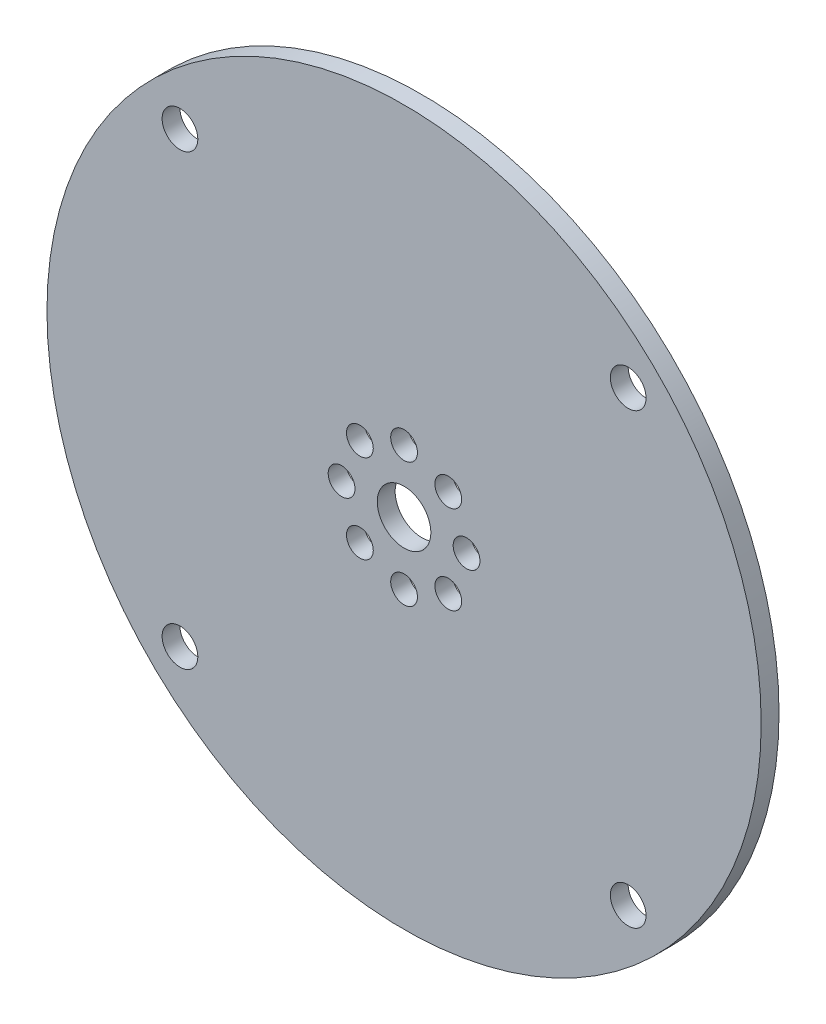
ISO-10303-21;
HEADER;
FILE_DESCRIPTION(('STEP AP214'),'2;1');
FILE_NAME('part.step','',(''),(''),'','','');
FILE_SCHEMA(('AUTOMOTIVE_DESIGN { 1 0 10303 214 1 1 1 1 }'));
ENDSEC;
DATA;
#1=APPLICATION_CONTEXT('core data for automotive mechanical design processes');
#2=APPLICATION_PROTOCOL_DEFINITION('international standard','automotive_design',2000,#1);
#3=PRODUCT_CONTEXT('',#1,'mechanical');
#4=PRODUCT('Part','Part','',(#3));
#5=PRODUCT_RELATED_PRODUCT_CATEGORY('part','',(#4));
#6=PRODUCT_DEFINITION_FORMATION('','',#4);
#7=PRODUCT_DEFINITION_CONTEXT('part definition',#1,'design');
#8=PRODUCT_DEFINITION('design','',#6,#7);
#9=PRODUCT_DEFINITION_SHAPE('','',#8);
#10=(LENGTH_UNIT() NAMED_UNIT(*) SI_UNIT(.MILLI.,.METRE.));
#11=(NAMED_UNIT(*) PLANE_ANGLE_UNIT() SI_UNIT($,.RADIAN.));
#12=(NAMED_UNIT(*) SI_UNIT($,.STERADIAN.) SOLID_ANGLE_UNIT());
#13=UNCERTAINTY_MEASURE_WITH_UNIT(LENGTH_MEASURE(1.E-05),#10,'distance_accuracy_value','');
#14=(GEOMETRIC_REPRESENTATION_CONTEXT(3) GLOBAL_UNCERTAINTY_ASSIGNED_CONTEXT((#13)) GLOBAL_UNIT_ASSIGNED_CONTEXT((#10,
#11,#12)) REPRESENTATION_CONTEXT('',''));
#15=CARTESIAN_POINT('',(0.,0.,0.));
#16=DIRECTION('',(0.,0.,1.));
#17=DIRECTION('',(1.,0.,0.));
#18=AXIS2_PLACEMENT_3D('',#15,#16,#17);
#19=CARTESIAN_POINT('',(2678.75201701699,1971.59180475259,2.));
#20=DIRECTION('',(0.,0.,-1.));
#21=DIRECTION('',(-1.,0.,0.));
#22=AXIS2_PLACEMENT_3D('',#19,#20,#21);
#23=CYLINDRICAL_SURFACE('',#22,2.00000000000022);
#24=CARTESIAN_POINT('',(2678.75201701699,1971.59180475259,2.));
#25=DIRECTION('',(0.,0.,1.));
#26=DIRECTION('',(1.,0.,0.));
#27=AXIS2_PLACEMENT_3D('',#24,#25,#26);
#28=CIRCLE('',#27,2.00000000000022);
#29=CARTESIAN_POINT('',(2680.75201701699,1971.59180475259,2.));
#30=VERTEX_POINT('',#29);
#31=EDGE_CURVE('E51',#30,#30,#28,.T.);
#32=ORIENTED_EDGE('',*,*,#31,.T.);
#33=EDGE_LOOP('',(#32));
#34=FACE_BOUND('',#33,.T.);
#35=CARTESIAN_POINT('',(2678.75201701699,1971.59180475259,0.));
#36=DIRECTION('',(0.,0.,1.));
#37=DIRECTION('',(1.,0.,0.));
#38=AXIS2_PLACEMENT_3D('',#35,#36,#37);
#39=CIRCLE('',#38,2.00000000000022);
#40=CARTESIAN_POINT('',(2680.75201701699,1971.59180475259,0.));
#41=VERTEX_POINT('',#40);
#42=EDGE_CURVE('E95',#41,#41,#39,.T.);
#43=ORIENTED_EDGE('',*,*,#42,.F.);
#44=EDGE_LOOP('',(#43));
#45=FACE_BOUND('',#44,.T.);
#46=ADVANCED_FACE('F43',(#34,#45),#23,.F.);
#47=CARTESIAN_POINT('',(2628.54743555275,1971.59180475259,2.));
#48=DIRECTION('',(0.,0.,-1.));
#49=DIRECTION('',(-1.,0.,0.));
#50=AXIS2_PLACEMENT_3D('',#47,#48,#49);
#51=CYLINDRICAL_SURFACE('',#50,1.99999999999978);
#52=CARTESIAN_POINT('',(2628.54743555275,1971.59180475259,2.));
#53=DIRECTION('',(0.,0.,1.));
#54=DIRECTION('',(1.,0.,0.));
#55=AXIS2_PLACEMENT_3D('',#52,#53,#54);
#56=CIRCLE('',#55,1.99999999999978);
#57=CARTESIAN_POINT('',(2630.54743555275,1971.59180475259,2.));
#58=VERTEX_POINT('',#57);
#59=EDGE_CURVE('E56',#58,#58,#56,.T.);
#60=ORIENTED_EDGE('',*,*,#59,.T.);
#61=EDGE_LOOP('',(#60));
#62=FACE_BOUND('',#61,.T.);
#63=CARTESIAN_POINT('',(2628.54743555275,1971.59180475259,0.));
#64=DIRECTION('',(0.,0.,1.));
#65=DIRECTION('',(1.,0.,0.));
#66=AXIS2_PLACEMENT_3D('',#63,#64,#65);
#67=CIRCLE('',#66,1.99999999999978);
#68=CARTESIAN_POINT('',(2630.54743555275,1971.59180475259,0.));
#69=VERTEX_POINT('',#68);
#70=EDGE_CURVE('E93',#69,#69,#67,.T.);
#71=ORIENTED_EDGE('',*,*,#70,.F.);
#72=EDGE_LOOP('',(#71));
#73=FACE_BOUND('',#72,.T.);
#74=ADVANCED_FACE('F140',(#62,#73),#51,.F.);
#75=CARTESIAN_POINT('',(2653.64972628487,1939.48951402047,2.));
#76=DIRECTION('',(0.,0.,-1.));
#77=DIRECTION('',(-1.,0.,0.));
#78=AXIS2_PLACEMENT_3D('',#75,#76,#77);
#79=CYLINDRICAL_SURFACE('',#78,1.50000000000006);
#80=CARTESIAN_POINT('',(2653.64972628487,1939.48951402047,2.));
#81=DIRECTION('',(0.,0.,1.));
#82=DIRECTION('',(1.,0.,0.));
#83=AXIS2_PLACEMENT_3D('',#80,#81,#82);
#84=CIRCLE('',#83,1.50000000000006);
#85=CARTESIAN_POINT('',(2655.14972628487,1939.48951402047,2.));
#86=VERTEX_POINT('',#85);
#87=EDGE_CURVE('E135',#86,#86,#84,.T.);
#88=ORIENTED_EDGE('',*,*,#87,.T.);
#89=EDGE_LOOP('',(#88));
#90=FACE_BOUND('',#89,.T.);
#91=CARTESIAN_POINT('',(2653.64972628487,1939.48951402047,0.));
#92=DIRECTION('',(0.,0.,1.));
#93=DIRECTION('',(1.,0.,0.));
#94=AXIS2_PLACEMENT_3D('',#91,#92,#93);
#95=CIRCLE('',#94,1.50000000000006);
#96=CARTESIAN_POINT('',(2655.14972628487,1939.48951402047,0.));
#97=VERTEX_POINT('',#96);
#98=EDGE_CURVE('E90',#97,#97,#95,.T.);
#99=ORIENTED_EDGE('',*,*,#98,.F.);
#100=EDGE_LOOP('',(#99));
#101=FACE_BOUND('',#100,.T.);
#102=ADVANCED_FACE('F158',(#90,#101),#79,.F.);
#103=CARTESIAN_POINT('',(2653.64972628487,1953.48951402047,2.));
#104=DIRECTION('',(0.,0.,-1.));
#105=DIRECTION('',(-1.,0.,0.));
#106=AXIS2_PLACEMENT_3D('',#103,#104,#105);
#107=CYLINDRICAL_SURFACE('',#106,1.50000000000006);
#108=CARTESIAN_POINT('',(2653.64972628487,1953.48951402047,2.));
#109=DIRECTION('',(0.,0.,1.));
#110=DIRECTION('',(1.,0.,0.));
#111=AXIS2_PLACEMENT_3D('',#108,#109,#110);
#112=CIRCLE('',#111,1.50000000000006);
#113=CARTESIAN_POINT('',(2655.14972628487,1953.48951402047,2.));
#114=VERTEX_POINT('',#113);
#115=EDGE_CURVE('E132',#114,#114,#112,.T.);
#116=ORIENTED_EDGE('',*,*,#115,.T.);
#117=EDGE_LOOP('',(#116));
#118=FACE_BOUND('',#117,.T.);
#119=CARTESIAN_POINT('',(2653.64972628487,1953.48951402047,0.));
#120=DIRECTION('',(0.,0.,1.));
#121=DIRECTION('',(1.,0.,0.));
#122=AXIS2_PLACEMENT_3D('',#119,#120,#121);
#123=CIRCLE('',#122,1.50000000000006);
#124=CARTESIAN_POINT('',(2655.14972628487,1953.48951402047,0.));
#125=VERTEX_POINT('',#124);
#126=EDGE_CURVE('E87',#125,#125,#123,.T.);
#127=ORIENTED_EDGE('',*,*,#126,.F.);
#128=EDGE_LOOP('',(#127));
#129=FACE_BOUND('',#128,.T.);
#130=ADVANCED_FACE('F165',(#118,#129),#107,.F.);
#131=CARTESIAN_POINT('',(2628.54743555275,1921.38722328835,2.));
#132=DIRECTION('',(0.,0.,-1.));
#133=DIRECTION('',(-1.,0.,0.));
#134=AXIS2_PLACEMENT_3D('',#131,#132,#133);
#135=CYLINDRICAL_SURFACE('',#134,1.99999999999978);
#136=CARTESIAN_POINT('',(2628.54743555275,1921.38722328835,2.));
#137=DIRECTION('',(0.,0.,1.));
#138=DIRECTION('',(1.,0.,0.));
#139=AXIS2_PLACEMENT_3D('',#136,#137,#138);
#140=CIRCLE('',#139,1.99999999999978);
#141=CARTESIAN_POINT('',(2630.54743555275,1921.38722328835,2.));
#142=VERTEX_POINT('',#141);
#143=EDGE_CURVE('E129',#142,#142,#140,.T.);
#144=ORIENTED_EDGE('',*,*,#143,.T.);
#145=EDGE_LOOP('',(#144));
#146=FACE_BOUND('',#145,.T.);
#147=CARTESIAN_POINT('',(2628.54743555275,1921.38722328835,0.));
#148=DIRECTION('',(0.,0.,1.));
#149=DIRECTION('',(1.,0.,0.));
#150=AXIS2_PLACEMENT_3D('',#147,#148,#149);
#151=CIRCLE('',#150,1.99999999999978);
#152=CARTESIAN_POINT('',(2630.54743555275,1921.38722328835,0.));
#153=VERTEX_POINT('',#152);
#154=EDGE_CURVE('E84',#153,#153,#151,.T.);
#155=ORIENTED_EDGE('',*,*,#154,.F.);
#156=EDGE_LOOP('',(#155));
#157=FACE_BOUND('',#156,.T.);
#158=ADVANCED_FACE('F169',(#146,#157),#135,.F.);
#159=CARTESIAN_POINT('',(2678.75201701699,1921.38722328835,2.));
#160=DIRECTION('',(0.,0.,-1.));
#161=DIRECTION('',(-1.,0.,0.));
#162=AXIS2_PLACEMENT_3D('',#159,#160,#161);
#163=CYLINDRICAL_SURFACE('',#162,2.00000000000022);
#164=CARTESIAN_POINT('',(2678.75201701699,1921.38722328835,2.));
#165=DIRECTION('',(0.,0.,1.));
#166=DIRECTION('',(1.,0.,0.));
#167=AXIS2_PLACEMENT_3D('',#164,#165,#166);
#168=CIRCLE('',#167,2.00000000000022);
#169=CARTESIAN_POINT('',(2680.75201701699,1921.38722328835,2.));
#170=VERTEX_POINT('',#169);
#171=EDGE_CURVE('E126',#170,#170,#168,.T.);
#172=ORIENTED_EDGE('',*,*,#171,.T.);
#173=EDGE_LOOP('',(#172));
#174=FACE_BOUND('',#173,.T.);
#175=CARTESIAN_POINT('',(2678.75201701699,1921.38722328835,0.));
#176=DIRECTION('',(0.,0.,1.));
#177=DIRECTION('',(1.,0.,0.));
#178=AXIS2_PLACEMENT_3D('',#175,#176,#177);
#179=CIRCLE('',#178,2.00000000000022);
#180=CARTESIAN_POINT('',(2680.75201701699,1921.38722328835,0.));
#181=VERTEX_POINT('',#180);
#182=EDGE_CURVE('E81',#181,#181,#179,.T.);
#183=ORIENTED_EDGE('',*,*,#182,.F.);
#184=EDGE_LOOP('',(#183));
#185=FACE_BOUND('',#184,.T.);
#186=ADVANCED_FACE('F173',(#174,#185),#163,.F.);
#187=CARTESIAN_POINT('',(2646.64972628487,1946.48951402047,2.));
#188=DIRECTION('',(0.,0.,-1.));
#189=DIRECTION('',(-1.,0.,0.));
#190=AXIS2_PLACEMENT_3D('',#187,#188,#189);
#191=CYLINDRICAL_SURFACE('',#190,1.50000000000006);
#192=CARTESIAN_POINT('',(2646.64972628487,1946.48951402047,2.));
#193=DIRECTION('',(0.,0.,1.));
#194=DIRECTION('',(1.,0.,0.));
#195=AXIS2_PLACEMENT_3D('',#192,#193,#194);
#196=CIRCLE('',#195,1.50000000000006);
#197=CARTESIAN_POINT('',(2648.14972628487,1946.48951402047,2.));
#198=VERTEX_POINT('',#197);
#199=EDGE_CURVE('E123',#198,#198,#196,.T.);
#200=ORIENTED_EDGE('',*,*,#199,.T.);
#201=EDGE_LOOP('',(#200));
#202=FACE_BOUND('',#201,.T.);
#203=CARTESIAN_POINT('',(2646.64972628487,1946.48951402047,0.));
#204=DIRECTION('',(0.,0.,1.));
#205=DIRECTION('',(1.,0.,0.));
#206=AXIS2_PLACEMENT_3D('',#203,#204,#205);
#207=CIRCLE('',#206,1.50000000000006);
#208=CARTESIAN_POINT('',(2648.14972628487,1946.48951402047,0.));
#209=VERTEX_POINT('',#208);
#210=EDGE_CURVE('E78',#209,#209,#207,.T.);
#211=ORIENTED_EDGE('',*,*,#210,.F.);
#212=EDGE_LOOP('',(#211));
#213=FACE_BOUND('',#212,.T.);
#214=ADVANCED_FACE('F177',(#202,#213),#191,.F.);
#215=CARTESIAN_POINT('',(2660.64972628487,1946.48951402047,2.));
#216=DIRECTION('',(0.,0.,-1.));
#217=DIRECTION('',(-1.,0.,0.));
#218=AXIS2_PLACEMENT_3D('',#215,#216,#217);
#219=CYLINDRICAL_SURFACE('',#218,1.50000000000006);
#220=CARTESIAN_POINT('',(2660.64972628487,1946.48951402047,2.));
#221=DIRECTION('',(0.,0.,1.));
#222=DIRECTION('',(1.,0.,0.));
#223=AXIS2_PLACEMENT_3D('',#220,#221,#222);
#224=CIRCLE('',#223,1.50000000000006);
#225=CARTESIAN_POINT('',(2662.14972628487,1946.48951402047,2.));
#226=VERTEX_POINT('',#225);
#227=EDGE_CURVE('E120',#226,#226,#224,.T.);
#228=ORIENTED_EDGE('',*,*,#227,.T.);
#229=EDGE_LOOP('',(#228));
#230=FACE_BOUND('',#229,.T.);
#231=CARTESIAN_POINT('',(2660.64972628487,1946.48951402047,0.));
#232=DIRECTION('',(0.,0.,1.));
#233=DIRECTION('',(1.,0.,0.));
#234=AXIS2_PLACEMENT_3D('',#231,#232,#233);
#235=CIRCLE('',#234,1.50000000000006);
#236=CARTESIAN_POINT('',(2662.14972628487,1946.48951402047,0.));
#237=VERTEX_POINT('',#236);
#238=EDGE_CURVE('E75',#237,#237,#235,.T.);
#239=ORIENTED_EDGE('',*,*,#238,.F.);
#240=EDGE_LOOP('',(#239));
#241=FACE_BOUND('',#240,.T.);
#242=ADVANCED_FACE('F181',(#230,#241),#219,.F.);
#243=CARTESIAN_POINT('',(2653.64972628487,1946.48951402047,2.));
#244=DIRECTION('',(0.,0.,-1.));
#245=DIRECTION('',(-1.,0.,0.));
#246=AXIS2_PLACEMENT_3D('',#243,#244,#245);
#247=CYLINDRICAL_SURFACE('',#246,3.00000000000011);
#248=CARTESIAN_POINT('',(2653.64972628487,1946.48951402047,2.));
#249=DIRECTION('',(0.,0.,1.));
#250=DIRECTION('',(1.,0.,0.));
#251=AXIS2_PLACEMENT_3D('',#248,#249,#250);
#252=CIRCLE('',#251,3.00000000000011);
#253=CARTESIAN_POINT('',(2656.64972628487,1946.48951402047,2.));
#254=VERTEX_POINT('',#253);
#255=EDGE_CURVE('E117',#254,#254,#252,.T.);
#256=ORIENTED_EDGE('',*,*,#255,.T.);
#257=EDGE_LOOP('',(#256));
#258=FACE_BOUND('',#257,.T.);
#259=CARTESIAN_POINT('',(2653.64972628487,1946.48951402047,0.));
#260=DIRECTION('',(0.,0.,1.));
#261=DIRECTION('',(1.,0.,0.));
#262=AXIS2_PLACEMENT_3D('',#259,#260,#261);
#263=CIRCLE('',#262,3.00000000000011);
#264=CARTESIAN_POINT('',(2656.64972628487,1946.48951402047,0.));
#265=VERTEX_POINT('',#264);
#266=EDGE_CURVE('E72',#265,#265,#263,.T.);
#267=ORIENTED_EDGE('',*,*,#266,.F.);
#268=EDGE_LOOP('',(#267));
#269=FACE_BOUND('',#268,.T.);
#270=ADVANCED_FACE('F185',(#258,#269),#247,.F.);
#271=CARTESIAN_POINT('',(2648.69997881656,1941.53976655217,2.));
#272=DIRECTION('',(0.,0.,-1.));
#273=DIRECTION('',(-1.,0.,0.));
#274=AXIS2_PLACEMENT_3D('',#271,#272,#273);
#275=CYLINDRICAL_SURFACE('',#274,1.50000000000006);
#276=CARTESIAN_POINT('',(2648.69997881656,1941.53976655217,2.));
#277=DIRECTION('',(0.,0.,1.));
#278=DIRECTION('',(1.,0.,0.));
#279=AXIS2_PLACEMENT_3D('',#276,#277,#278);
#280=CIRCLE('',#279,1.50000000000006);
#281=CARTESIAN_POINT('',(2650.19997881656,1941.53976655217,2.));
#282=VERTEX_POINT('',#281);
#283=EDGE_CURVE('E114',#282,#282,#280,.T.);
#284=ORIENTED_EDGE('',*,*,#283,.T.);
#285=EDGE_LOOP('',(#284));
#286=FACE_BOUND('',#285,.T.);
#287=CARTESIAN_POINT('',(2648.69997881656,1941.53976655217,0.));
#288=DIRECTION('',(0.,0.,1.));
#289=DIRECTION('',(1.,0.,0.));
#290=AXIS2_PLACEMENT_3D('',#287,#288,#289);
#291=CIRCLE('',#290,1.50000000000006);
#292=CARTESIAN_POINT('',(2650.19997881656,1941.53976655217,0.));
#293=VERTEX_POINT('',#292);
#294=EDGE_CURVE('E69',#293,#293,#291,.T.);
#295=ORIENTED_EDGE('',*,*,#294,.F.);
#296=EDGE_LOOP('',(#295));
#297=FACE_BOUND('',#296,.T.);
#298=ADVANCED_FACE('F189',(#286,#297),#275,.F.);
#299=CARTESIAN_POINT('',(2658.59947375317,1941.53976655217,2.));
#300=DIRECTION('',(0.,0.,-1.));
#301=DIRECTION('',(-1.,0.,0.));
#302=AXIS2_PLACEMENT_3D('',#299,#300,#301);
#303=CYLINDRICAL_SURFACE('',#302,1.50000000000006);
#304=CARTESIAN_POINT('',(2658.59947375317,1941.53976655217,2.));
#305=DIRECTION('',(0.,0.,1.));
#306=DIRECTION('',(1.,0.,0.));
#307=AXIS2_PLACEMENT_3D('',#304,#305,#306);
#308=CIRCLE('',#307,1.50000000000006);
#309=CARTESIAN_POINT('',(2660.09947375317,1941.53976655217,2.));
#310=VERTEX_POINT('',#309);
#311=EDGE_CURVE('E109',#310,#310,#308,.T.);
#312=ORIENTED_EDGE('',*,*,#311,.T.);
#313=EDGE_LOOP('',(#312));
#314=FACE_BOUND('',#313,.T.);
#315=CARTESIAN_POINT('',(2658.59947375317,1941.53976655217,0.));
#316=DIRECTION('',(0.,0.,1.));
#317=DIRECTION('',(1.,0.,0.));
#318=AXIS2_PLACEMENT_3D('',#315,#316,#317);
#319=CIRCLE('',#318,1.50000000000006);
#320=CARTESIAN_POINT('',(2660.09947375317,1941.53976655217,0.));
#321=VERTEX_POINT('',#320);
#322=EDGE_CURVE('E66',#321,#321,#319,.T.);
#323=ORIENTED_EDGE('',*,*,#322,.F.);
#324=EDGE_LOOP('',(#323));
#325=FACE_BOUND('',#324,.T.);
#326=ADVANCED_FACE('F193',(#314,#325),#303,.F.);
#327=CARTESIAN_POINT('',(2648.69997881656,1951.43926148878,2.));
#328=DIRECTION('',(0.,0.,-1.));
#329=DIRECTION('',(-1.,0.,0.));
#330=AXIS2_PLACEMENT_3D('',#327,#328,#329);
#331=CYLINDRICAL_SURFACE('',#330,1.50000000000006);
#332=CARTESIAN_POINT('',(2648.69997881656,1951.43926148878,2.));
#333=DIRECTION('',(0.,0.,1.));
#334=DIRECTION('',(1.,0.,0.));
#335=AXIS2_PLACEMENT_3D('',#332,#333,#334);
#336=CIRCLE('',#335,1.50000000000006);
#337=CARTESIAN_POINT('',(2650.19997881656,1951.43926148878,2.));
#338=VERTEX_POINT('',#337);
#339=EDGE_CURVE('E104',#338,#338,#336,.T.);
#340=ORIENTED_EDGE('',*,*,#339,.T.);
#341=EDGE_LOOP('',(#340));
#342=FACE_BOUND('',#341,.T.);
#343=CARTESIAN_POINT('',(2648.69997881656,1951.43926148878,0.));
#344=DIRECTION('',(0.,0.,1.));
#345=DIRECTION('',(1.,0.,0.));
#346=AXIS2_PLACEMENT_3D('',#343,#344,#345);
#347=CIRCLE('',#346,1.50000000000006);
#348=CARTESIAN_POINT('',(2650.19997881656,1951.43926148878,0.));
#349=VERTEX_POINT('',#348);
#350=EDGE_CURVE('E63',#349,#349,#347,.T.);
#351=ORIENTED_EDGE('',*,*,#350,.F.);
#352=EDGE_LOOP('',(#351));
#353=FACE_BOUND('',#352,.T.);
#354=ADVANCED_FACE('F196',(#342,#353),#331,.F.);
#355=CARTESIAN_POINT('',(2658.59947375317,1951.43926148878,2.));
#356=DIRECTION('',(0.,0.,-1.));
#357=DIRECTION('',(-1.,0.,0.));
#358=AXIS2_PLACEMENT_3D('',#355,#356,#357);
#359=CYLINDRICAL_SURFACE('',#358,1.50000000000006);
#360=CARTESIAN_POINT('',(2658.59947375317,1951.43926148878,2.));
#361=DIRECTION('',(0.,0.,1.));
#362=DIRECTION('',(1.,0.,0.));
#363=AXIS2_PLACEMENT_3D('',#360,#361,#362);
#364=CIRCLE('',#363,1.50000000000006);
#365=CARTESIAN_POINT('',(2660.09947375317,1951.43926148878,2.));
#366=VERTEX_POINT('',#365);
#367=EDGE_CURVE('E100',#366,#366,#364,.T.);
#368=ORIENTED_EDGE('',*,*,#367,.T.);
#369=EDGE_LOOP('',(#368));
#370=FACE_BOUND('',#369,.T.);
#371=CARTESIAN_POINT('',(2658.59947375317,1951.43926148878,0.));
#372=DIRECTION('',(0.,0.,1.));
#373=DIRECTION('',(1.,0.,0.));
#374=AXIS2_PLACEMENT_3D('',#371,#372,#373);
#375=CIRCLE('',#374,1.50000000000006);
#376=CARTESIAN_POINT('',(2660.09947375317,1951.43926148878,0.));
#377=VERTEX_POINT('',#376);
#378=EDGE_CURVE('E60',#377,#377,#375,.T.);
#379=ORIENTED_EDGE('',*,*,#378,.F.);
#380=EDGE_LOOP('',(#379));
#381=FACE_BOUND('',#380,.T.);
#382=ADVANCED_FACE('F45',(#370,#381),#359,.F.);
#383=CARTESIAN_POINT('',(2653.64972628487,1946.48951402047,2.));
#384=DIRECTION('',(0.,0.,-1.));
#385=DIRECTION('',(-1.,0.,0.));
#386=AXIS2_PLACEMENT_3D('',#383,#384,#385);
#387=CYLINDRICAL_SURFACE('',#386,40.);
#388=CARTESIAN_POINT('',(2653.64972628487,1946.48951402047,2.));
#389=DIRECTION('',(0.,0.,1.));
#390=DIRECTION('',(1.,0.,0.));
#391=AXIS2_PLACEMENT_3D('',#388,#389,#390);
#392=CIRCLE('',#391,40.);
#393=CARTESIAN_POINT('',(2693.64972628487,1946.48951402047,2.));
#394=VERTEX_POINT('',#393);
#395=EDGE_CURVE('E10',#394,#394,#392,.T.);
#396=ORIENTED_EDGE('',*,*,#395,.F.);
#397=EDGE_LOOP('',(#396));
#398=FACE_BOUND('',#397,.T.);
#399=CARTESIAN_POINT('',(2653.64972628487,1946.48951402047,0.));
#400=DIRECTION('',(0.,0.,1.));
#401=DIRECTION('',(1.,0.,0.));
#402=AXIS2_PLACEMENT_3D('',#399,#400,#401);
#403=CIRCLE('',#402,40.);
#404=CARTESIAN_POINT('',(2693.64972628487,1946.48951402047,0.));
#405=VERTEX_POINT('',#404);
#406=EDGE_CURVE('E47',#405,#405,#403,.T.);
#407=ORIENTED_EDGE('',*,*,#406,.T.);
#408=EDGE_LOOP('',(#407));
#409=FACE_BOUND('',#408,.T.);
#410=ADVANCED_FACE('F147',(#398,#409),#387,.T.);
#411=CARTESIAN_POINT('',(0.,0.,2.));
#412=DIRECTION('',(0.,0.,1.));
#413=DIRECTION('',(1.,0.,0.));
#414=AXIS2_PLACEMENT_3D('',#411,#412,#413);
#415=PLANE('',#414);
#416=ORIENTED_EDGE('',*,*,#367,.F.);
#417=EDGE_LOOP('',(#416));
#418=FACE_BOUND('',#417,.T.);
#419=ORIENTED_EDGE('',*,*,#339,.F.);
#420=EDGE_LOOP('',(#419));
#421=FACE_BOUND('',#420,.T.);
#422=ORIENTED_EDGE('',*,*,#311,.F.);
#423=EDGE_LOOP('',(#422));
#424=FACE_BOUND('',#423,.T.);
#425=ORIENTED_EDGE('',*,*,#283,.F.);
#426=EDGE_LOOP('',(#425));
#427=FACE_BOUND('',#426,.T.);
#428=ORIENTED_EDGE('',*,*,#255,.F.);
#429=EDGE_LOOP('',(#428));
#430=FACE_BOUND('',#429,.T.);
#431=ORIENTED_EDGE('',*,*,#227,.F.);
#432=EDGE_LOOP('',(#431));
#433=FACE_BOUND('',#432,.T.);
#434=ORIENTED_EDGE('',*,*,#199,.F.);
#435=EDGE_LOOP('',(#434));
#436=FACE_BOUND('',#435,.T.);
#437=ORIENTED_EDGE('',*,*,#171,.F.);
#438=EDGE_LOOP('',(#437));
#439=FACE_BOUND('',#438,.T.);
#440=ORIENTED_EDGE('',*,*,#143,.F.);
#441=EDGE_LOOP('',(#440));
#442=FACE_BOUND('',#441,.T.);
#443=ORIENTED_EDGE('',*,*,#115,.F.);
#444=EDGE_LOOP('',(#443));
#445=FACE_BOUND('',#444,.T.);
#446=ORIENTED_EDGE('',*,*,#87,.F.);
#447=EDGE_LOOP('',(#446));
#448=FACE_BOUND('',#447,.T.);
#449=ORIENTED_EDGE('',*,*,#59,.F.);
#450=EDGE_LOOP('',(#449));
#451=FACE_BOUND('',#450,.T.);
#452=ORIENTED_EDGE('',*,*,#31,.F.);
#453=EDGE_LOOP('',(#452));
#454=FACE_BOUND('',#453,.T.);
#455=ORIENTED_EDGE('',*,*,#395,.T.);
#456=EDGE_LOOP('',(#455));
#457=FACE_BOUND('',#456,.T.);
#458=ADVANCED_FACE('F143',(#418,#421,#424,#427,#430,#433,#436,#439,#442,#445,#448,#451,#454,
#457),#415,.T.);
#459=CARTESIAN_POINT('',(0.,0.,0.));
#460=DIRECTION('',(0.,0.,1.));
#461=DIRECTION('',(1.,0.,0.));
#462=AXIS2_PLACEMENT_3D('',#459,#460,#461);
#463=PLANE('',#462);
#464=ORIENTED_EDGE('',*,*,#378,.T.);
#465=EDGE_LOOP('',(#464));
#466=FACE_BOUND('',#465,.T.);
#467=ORIENTED_EDGE('',*,*,#350,.T.);
#468=EDGE_LOOP('',(#467));
#469=FACE_BOUND('',#468,.T.);
#470=ORIENTED_EDGE('',*,*,#322,.T.);
#471=EDGE_LOOP('',(#470));
#472=FACE_BOUND('',#471,.T.);
#473=ORIENTED_EDGE('',*,*,#294,.T.);
#474=EDGE_LOOP('',(#473));
#475=FACE_BOUND('',#474,.T.);
#476=ORIENTED_EDGE('',*,*,#266,.T.);
#477=EDGE_LOOP('',(#476));
#478=FACE_BOUND('',#477,.T.);
#479=ORIENTED_EDGE('',*,*,#238,.T.);
#480=EDGE_LOOP('',(#479));
#481=FACE_BOUND('',#480,.T.);
#482=ORIENTED_EDGE('',*,*,#210,.T.);
#483=EDGE_LOOP('',(#482));
#484=FACE_BOUND('',#483,.T.);
#485=ORIENTED_EDGE('',*,*,#182,.T.);
#486=EDGE_LOOP('',(#485));
#487=FACE_BOUND('',#486,.T.);
#488=ORIENTED_EDGE('',*,*,#154,.T.);
#489=EDGE_LOOP('',(#488));
#490=FACE_BOUND('',#489,.T.);
#491=ORIENTED_EDGE('',*,*,#126,.T.);
#492=EDGE_LOOP('',(#491));
#493=FACE_BOUND('',#492,.T.);
#494=ORIENTED_EDGE('',*,*,#98,.T.);
#495=EDGE_LOOP('',(#494));
#496=FACE_BOUND('',#495,.T.);
#497=ORIENTED_EDGE('',*,*,#70,.T.);
#498=EDGE_LOOP('',(#497));
#499=FACE_BOUND('',#498,.T.);
#500=ORIENTED_EDGE('',*,*,#42,.T.);
#501=EDGE_LOOP('',(#500));
#502=FACE_BOUND('',#501,.T.);
#503=ORIENTED_EDGE('',*,*,#406,.F.);
#504=EDGE_LOOP('',(#503));
#505=FACE_BOUND('',#504,.T.);
#506=ADVANCED_FACE('F146',(#466,#469,#472,#475,#478,#481,#484,#487,#490,#493,#496,#499,#502,
#505),#463,.F.);
#507=CLOSED_SHELL('',(#46,#74,#102,#130,#158,#186,#214,#242,#270,#298,#326,#354,#382,#410,#458,#506));
#508=MANIFOLD_SOLID_BREP('B2',#507);
#509=ADVANCED_BREP_SHAPE_REPRESENTATION('',(#18,#508),#14);
#510=SHAPE_DEFINITION_REPRESENTATION(#9,#509);
ENDSEC;
END-ISO-10303-21;
